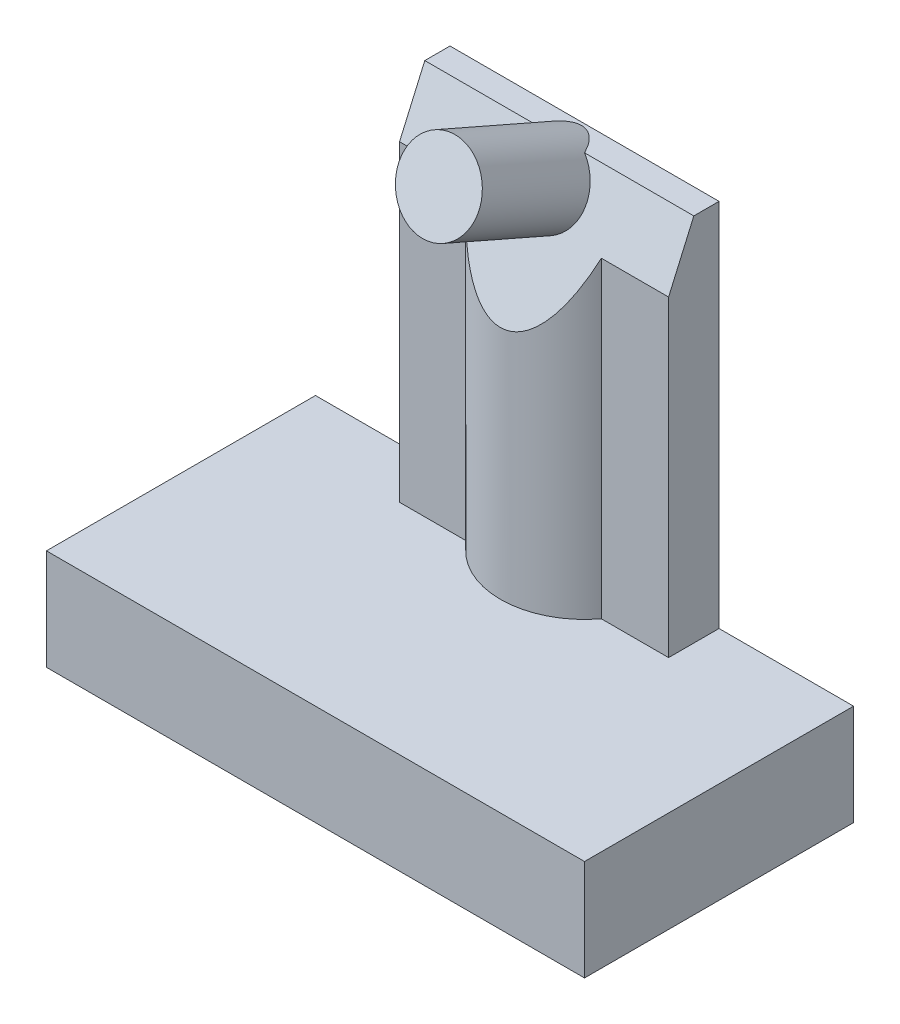
ISO-10303-21;
HEADER;
FILE_DESCRIPTION(('STEP AP214'),'2;1');
FILE_NAME('part.step','',(''),(''),'','','');
FILE_SCHEMA(('AUTOMOTIVE_DESIGN { 1 0 10303 214 1 1 1 1 }'));
ENDSEC;
DATA;
#1=APPLICATION_CONTEXT('core data for automotive mechanical design processes');
#2=APPLICATION_PROTOCOL_DEFINITION('international standard','automotive_design',2000,#1);
#3=PRODUCT_CONTEXT('',#1,'mechanical');
#4=PRODUCT('Part','Part','',(#3));
#5=PRODUCT_RELATED_PRODUCT_CATEGORY('part','',(#4));
#6=PRODUCT_DEFINITION_FORMATION('','',#4);
#7=PRODUCT_DEFINITION_CONTEXT('part definition',#1,'design');
#8=PRODUCT_DEFINITION('design','',#6,#7);
#9=PRODUCT_DEFINITION_SHAPE('','',#8);
#10=(LENGTH_UNIT() NAMED_UNIT(*) SI_UNIT(.MILLI.,.METRE.));
#11=(NAMED_UNIT(*) PLANE_ANGLE_UNIT() SI_UNIT($,.RADIAN.));
#12=(NAMED_UNIT(*) SI_UNIT($,.STERADIAN.) SOLID_ANGLE_UNIT());
#13=UNCERTAINTY_MEASURE_WITH_UNIT(LENGTH_MEASURE(1.E-05),#10,'distance_accuracy_value','');
#14=(GEOMETRIC_REPRESENTATION_CONTEXT(3) GLOBAL_UNCERTAINTY_ASSIGNED_CONTEXT((#13)) GLOBAL_UNIT_ASSIGNED_CONTEXT((#10,
#11,#12)) REPRESENTATION_CONTEXT('',''));
#15=CARTESIAN_POINT('',(0.,0.,0.));
#16=DIRECTION('',(0.,0.,1.));
#17=DIRECTION('',(1.,0.,0.));
#18=AXIS2_PLACEMENT_3D('',#15,#16,#17);
#19=CARTESIAN_POINT('',(-8.,10.,-1.5));
#20=DIRECTION('',(0.,-0.400818834019708,-0.916157334902189));
#21=DIRECTION('',(0.,0.916157334902189,-0.400818834019708));
#22=AXIS2_PLACEMENT_3D('',#19,#20,#21);
#23=PLANE('',#22);
#24=CARTESIAN_POINT('',(0.,13.1428571428571,-2.875));
#25=DIRECTION('',(0.,0.400818834019708,0.916157334902189));
#26=DIRECTION('',(0.,-0.916157334902189,0.400818834019708));
#27=AXIS2_PLACEMENT_3D('',#24,#25,#26);
#28=CIRCLE('',#27,1.2);
#29=CARTESIAN_POINT('',(-0.751452674789956,14.,-3.25));
#30=VERTEX_POINT('',#29);
#31=CARTESIAN_POINT('',(0.751452674789951,14.,-3.25000000000001));
#32=VERTEX_POINT('',#31);
#33=EDGE_CURVE('E51',#30,#32,#28,.T.);
#34=ORIENTED_EDGE('',*,*,#33,.F.);
#35=DIRECTION('',(-1.,0.,0.));
#36=VECTOR('',#35,1.);
#37=CARTESIAN_POINT('',(0.,14.,-3.25));
#38=LINE('',#37,#36);
#39=CARTESIAN_POINT('',(-4.00000000000001,14.,-3.25));
#40=VERTEX_POINT('',#39);
#41=EDGE_CURVE('E45',#30,#40,#38,.T.);
#42=ORIENTED_EDGE('',*,*,#41,.T.);
#43=DIRECTION('',(0.,0.916157334902189,-0.400818834019708));
#44=VECTOR('',#43,1.);
#45=CARTESIAN_POINT('',(-4.,12.8065573770492,-2.72786885245902));
#46=LINE('',#45,#44);
#47=CARTESIAN_POINT('',(-4.,12.2857142857143,-2.5));
#48=VERTEX_POINT('',#47);
#49=EDGE_CURVE('E169',#48,#40,#46,.T.);
#50=ORIENTED_EDGE('',*,*,#49,.F.);
#51=DIRECTION('',(-1.,0.,0.));
#52=VECTOR('',#51,1.);
#53=CARTESIAN_POINT('',(0.,12.2857142857143,-2.5));
#54=LINE('',#53,#52);
#55=CARTESIAN_POINT('',(-2.,12.2857142857143,-2.5));
#56=VERTEX_POINT('',#55);
#57=EDGE_CURVE('E166',#56,#48,#54,.T.);
#58=ORIENTED_EDGE('',*,*,#57,.F.);
#59=CARTESIAN_POINT('',(0.,15.7142857142857,-4.));
#60=DIRECTION('',(0.,-0.400818834019708,-0.916157334902189));
#61=DIRECTION('',(0.,-0.916157334902189,0.400818834019708));
#62=AXIS2_PLACEMENT_3D('',#59,#60,#61);
#63=ELLIPSE('',#62,6.23723185591892,2.5);
#64=CARTESIAN_POINT('',(2.,12.2857142857143,-2.5));
#65=VERTEX_POINT('',#64);
#66=EDGE_CURVE('E164',#65,#56,#63,.T.);
#67=ORIENTED_EDGE('',*,*,#66,.F.);
#68=DIRECTION('',(1.,0.,0.));
#69=VECTOR('',#68,1.);
#70=CARTESIAN_POINT('',(0.,12.2857142857143,-2.5));
#71=LINE('',#70,#69);
#72=CARTESIAN_POINT('',(4.,12.2857142857143,-2.5));
#73=VERTEX_POINT('',#72);
#74=EDGE_CURVE('E162',#65,#73,#71,.T.);
#75=ORIENTED_EDGE('',*,*,#74,.T.);
#76=DIRECTION('',(0.,0.916157334902189,-0.400818834019708));
#77=VECTOR('',#76,1.);
#78=CARTESIAN_POINT('',(4.,10.,-1.5));
#79=LINE('',#78,#77);
#80=CARTESIAN_POINT('',(4.,14.,-3.25));
#81=VERTEX_POINT('',#80);
#82=EDGE_CURVE('E57',#73,#81,#79,.T.);
#83=ORIENTED_EDGE('',*,*,#82,.T.);
#84=EDGE_CURVE('E11',#81,#32,#38,.T.);
#85=ORIENTED_EDGE('',*,*,#84,.T.);
#86=EDGE_LOOP('',(#34,#42,#50,#58,#67,#75,#83,#85));
#87=FACE_BOUND('',#86,.T.);
#88=ADVANCED_FACE('F37',(#87),#23,.F.);
#89=CARTESIAN_POINT('',(0.,3.,0.));
#90=DIRECTION('',(0.,1.,0.));
#91=DIRECTION('',(0.,0.,1.));
#92=AXIS2_PLACEMENT_3D('',#89,#90,#91);
#93=PLANE('',#92);
#94=DIRECTION('',(-1.,0.,0.));
#95=VECTOR('',#94,1.);
#96=CARTESIAN_POINT('',(-8.,3.,-4.));
#97=LINE('',#96,#95);
#98=CARTESIAN_POINT('',(8.,3.,-4.));
#99=VERTEX_POINT('',#98);
#100=CARTESIAN_POINT('',(4.,3.,-4.));
#101=VERTEX_POINT('',#100);
#102=EDGE_CURVE('E254',#99,#101,#97,.T.);
#103=ORIENTED_EDGE('',*,*,#102,.T.);
#104=DIRECTION('',(0.,0.,1.));
#105=VECTOR('',#104,1.);
#106=CARTESIAN_POINT('',(4.,3.,0.));
#107=LINE('',#106,#105);
#108=CARTESIAN_POINT('',(4.,3.,-2.5));
#109=VERTEX_POINT('',#108);
#110=EDGE_CURVE('E177',#101,#109,#107,.T.);
#111=ORIENTED_EDGE('',*,*,#110,.T.);
#112=DIRECTION('',(-1.,0.,0.));
#113=VECTOR('',#112,1.);
#114=CARTESIAN_POINT('',(0.,3.,-2.5));
#115=LINE('',#114,#113);
#116=CARTESIAN_POINT('',(2.,3.,-2.5));
#117=VERTEX_POINT('',#116);
#118=EDGE_CURVE('E190',#109,#117,#115,.T.);
#119=ORIENTED_EDGE('',*,*,#118,.T.);
#120=CARTESIAN_POINT('',(0.,3.,-4.));
#121=DIRECTION('',(0.,1.,0.));
#122=DIRECTION('',(0.,0.,1.));
#123=AXIS2_PLACEMENT_3D('',#120,#121,#122);
#124=CIRCLE('',#123,2.5);
#125=CARTESIAN_POINT('',(-2.,3.,-2.5));
#126=VERTEX_POINT('',#125);
#127=EDGE_CURVE('E187',#126,#117,#124,.T.);
#128=ORIENTED_EDGE('',*,*,#127,.F.);
#129=DIRECTION('',(1.,0.,0.));
#130=VECTOR('',#129,1.);
#131=CARTESIAN_POINT('',(0.,3.,-2.5));
#132=LINE('',#131,#130);
#133=CARTESIAN_POINT('',(-4.,3.,-2.5));
#134=VERTEX_POINT('',#133);
#135=EDGE_CURVE('E184',#134,#126,#132,.T.);
#136=ORIENTED_EDGE('',*,*,#135,.F.);
#137=DIRECTION('',(0.,0.,1.));
#138=VECTOR('',#137,1.);
#139=CARTESIAN_POINT('',(-4.,3.,0.));
#140=LINE('',#139,#138);
#141=CARTESIAN_POINT('',(-4.00000000000001,3.,-4.));
#142=VERTEX_POINT('',#141);
#143=EDGE_CURVE('E172',#142,#134,#140,.T.);
#144=ORIENTED_EDGE('',*,*,#143,.F.);
#145=CARTESIAN_POINT('',(-8.,3.,-4.));
#146=VERTEX_POINT('',#145);
#147=EDGE_CURVE('E252',#142,#146,#97,.T.);
#148=ORIENTED_EDGE('',*,*,#147,.T.);
#149=DIRECTION('',(0.,0.,1.));
#150=VECTOR('',#149,1.);
#151=CARTESIAN_POINT('',(-8.,3.,-4.));
#152=LINE('',#151,#150);
#153=CARTESIAN_POINT('',(-8.,3.,4.));
#154=VERTEX_POINT('',#153);
#155=EDGE_CURVE('E256',#146,#154,#152,.T.);
#156=ORIENTED_EDGE('',*,*,#155,.T.);
#157=DIRECTION('',(1.,0.,0.));
#158=VECTOR('',#157,1.);
#159=CARTESIAN_POINT('',(-8.,3.,4.));
#160=LINE('',#159,#158);
#161=CARTESIAN_POINT('',(7.99999999999999,3.,4.));
#162=VERTEX_POINT('',#161);
#163=EDGE_CURVE('E258',#154,#162,#160,.T.);
#164=ORIENTED_EDGE('',*,*,#163,.T.);
#165=DIRECTION('',(0.,0.,-1.));
#166=VECTOR('',#165,1.);
#167=CARTESIAN_POINT('',(8.,3.,-4.));
#168=LINE('',#167,#166);
#169=EDGE_CURVE('E249',#162,#99,#168,.T.);
#170=ORIENTED_EDGE('',*,*,#169,.T.);
#171=EDGE_LOOP('',(#103,#111,#119,#128,#136,#144,#148,#156,#164,#170));
#172=FACE_BOUND('',#171,.T.);
#173=ADVANCED_FACE('F294',(#172),#93,.T.);
#174=CARTESIAN_POINT('',(8.,3.,-4.));
#175=DIRECTION('',(-1.,0.,0.));
#176=DIRECTION('',(0.,0.,1.));
#177=AXIS2_PLACEMENT_3D('',#174,#175,#176);
#178=PLANE('',#177);
#179=DIRECTION('',(0.,0.,-1.));
#180=VECTOR('',#179,1.);
#181=CARTESIAN_POINT('',(8.,0.,-4.));
#182=LINE('',#181,#180);
#183=CARTESIAN_POINT('',(7.99999999999999,0.,4.));
#184=VERTEX_POINT('',#183);
#185=CARTESIAN_POINT('',(8.,0.,-4.));
#186=VERTEX_POINT('',#185);
#187=EDGE_CURVE('E221',#184,#186,#182,.T.);
#188=ORIENTED_EDGE('',*,*,#187,.T.);
#189=DIRECTION('',(0.,-1.,0.));
#190=VECTOR('',#189,1.);
#191=CARTESIAN_POINT('',(8.,3.,-4.));
#192=LINE('',#191,#190);
#193=EDGE_CURVE('E276',#99,#186,#192,.T.);
#194=ORIENTED_EDGE('',*,*,#193,.F.);
#195=ORIENTED_EDGE('',*,*,#169,.F.);
#196=DIRECTION('',(0.,-1.,0.));
#197=VECTOR('',#196,1.);
#198=CARTESIAN_POINT('',(7.99999999999999,3.,4.));
#199=LINE('',#198,#197);
#200=EDGE_CURVE('E260',#162,#184,#199,.T.);
#201=ORIENTED_EDGE('',*,*,#200,.T.);
#202=EDGE_LOOP('',(#188,#194,#195,#201));
#203=FACE_BOUND('',#202,.T.);
#204=ADVANCED_FACE('F39',(#203),#178,.F.);
#205=CARTESIAN_POINT('',(-8.,3.,-4.));
#206=DIRECTION('',(0.,0.,1.));
#207=DIRECTION('',(1.,0.,0.));
#208=AXIS2_PLACEMENT_3D('',#205,#206,#207);
#209=PLANE('',#208);
#210=DIRECTION('',(-1.,0.,0.));
#211=VECTOR('',#210,1.);
#212=CARTESIAN_POINT('',(-8.,0.,-4.));
#213=LINE('',#212,#211);
#214=CARTESIAN_POINT('',(-8.,0.,-4.));
#215=VERTEX_POINT('',#214);
#216=EDGE_CURVE('E263',#186,#215,#213,.T.);
#217=ORIENTED_EDGE('',*,*,#216,.T.);
#218=DIRECTION('',(0.,-1.,0.));
#219=VECTOR('',#218,1.);
#220=CARTESIAN_POINT('',(-8.,3.,-4.));
#221=LINE('',#220,#219);
#222=EDGE_CURVE('E273',#146,#215,#221,.T.);
#223=ORIENTED_EDGE('',*,*,#222,.F.);
#224=ORIENTED_EDGE('',*,*,#147,.F.);
#225=DIRECTION('',(0.,-1.,0.));
#226=VECTOR('',#225,1.);
#227=CARTESIAN_POINT('',(-4.00000000000001,14.,-4.));
#228=LINE('',#227,#226);
#229=CARTESIAN_POINT('',(-4.00000000000001,14.,-4.));
#230=VERTEX_POINT('',#229);
#231=EDGE_CURVE('E205',#230,#142,#228,.T.);
#232=ORIENTED_EDGE('',*,*,#231,.F.);
#233=DIRECTION('',(-1.,0.,0.));
#234=VECTOR('',#233,1.);
#235=CARTESIAN_POINT('',(0.,14.,-4.));
#236=LINE('',#235,#234);
#237=CARTESIAN_POINT('',(4.,14.,-4.));
#238=VERTEX_POINT('',#237);
#239=EDGE_CURVE('E173',#238,#230,#236,.T.);
#240=ORIENTED_EDGE('',*,*,#239,.F.);
#241=DIRECTION('',(0.,-1.,0.));
#242=VECTOR('',#241,1.);
#243=CARTESIAN_POINT('',(4.,14.,-4.));
#244=LINE('',#243,#242);
#245=EDGE_CURVE('E181',#238,#101,#244,.T.);
#246=ORIENTED_EDGE('',*,*,#245,.T.);
#247=ORIENTED_EDGE('',*,*,#102,.F.);
#248=ORIENTED_EDGE('',*,*,#193,.T.);
#249=EDGE_LOOP('',(#217,#223,#224,#232,#240,#246,#247,#248));
#250=FACE_BOUND('',#249,.T.);
#251=ADVANCED_FACE('F290',(#250),#209,.F.);
#252=CARTESIAN_POINT('',(-8.,3.,-4.));
#253=DIRECTION('',(1.,0.,0.));
#254=DIRECTION('',(0.,0.,-1.));
#255=AXIS2_PLACEMENT_3D('',#252,#253,#254);
#256=PLANE('',#255);
#257=DIRECTION('',(0.,0.,1.));
#258=VECTOR('',#257,1.);
#259=CARTESIAN_POINT('',(-8.,0.,-4.));
#260=LINE('',#259,#258);
#261=CARTESIAN_POINT('',(-8.,0.,4.));
#262=VERTEX_POINT('',#261);
#263=EDGE_CURVE('E265',#215,#262,#260,.T.);
#264=ORIENTED_EDGE('',*,*,#263,.T.);
#265=DIRECTION('',(0.,-1.,0.));
#266=VECTOR('',#265,1.);
#267=CARTESIAN_POINT('',(-8.,3.,4.));
#268=LINE('',#267,#266);
#269=EDGE_CURVE('E270',#154,#262,#268,.T.);
#270=ORIENTED_EDGE('',*,*,#269,.F.);
#271=ORIENTED_EDGE('',*,*,#155,.F.);
#272=ORIENTED_EDGE('',*,*,#222,.T.);
#273=EDGE_LOOP('',(#264,#270,#271,#272));
#274=FACE_BOUND('',#273,.T.);
#275=ADVANCED_FACE('F344',(#274),#256,.F.);
#276=CARTESIAN_POINT('',(-8.,3.,4.));
#277=DIRECTION('',(0.,0.,-1.));
#278=DIRECTION('',(-1.,0.,0.));
#279=AXIS2_PLACEMENT_3D('',#276,#277,#278);
#280=PLANE('',#279);
#281=DIRECTION('',(1.,0.,0.));
#282=VECTOR('',#281,1.);
#283=CARTESIAN_POINT('',(-8.,0.,4.));
#284=LINE('',#283,#282);
#285=EDGE_CURVE('E253',#262,#184,#284,.T.);
#286=ORIENTED_EDGE('',*,*,#285,.T.);
#287=ORIENTED_EDGE('',*,*,#200,.F.);
#288=ORIENTED_EDGE('',*,*,#163,.F.);
#289=ORIENTED_EDGE('',*,*,#269,.T.);
#290=EDGE_LOOP('',(#286,#287,#288,#289));
#291=FACE_BOUND('',#290,.T.);
#292=ADVANCED_FACE('F347',(#291),#280,.F.);
#293=CARTESIAN_POINT('',(0.,0.,0.));
#294=DIRECTION('',(0.,1.,0.));
#295=DIRECTION('',(0.,0.,1.));
#296=AXIS2_PLACEMENT_3D('',#293,#294,#295);
#297=PLANE('',#296);
#298=DIRECTION('',(1.,0.,0.));
#299=VECTOR('',#298,1.);
#300=CARTESIAN_POINT('',(-8.,0.,3.));
#301=LINE('',#300,#299);
#302=CARTESIAN_POINT('',(-7.,0.,3.));
#303=VERTEX_POINT('',#302);
#304=CARTESIAN_POINT('',(6.99999999999999,0.,3.));
#305=VERTEX_POINT('',#304);
#306=EDGE_CURVE('E227',#303,#305,#301,.T.);
#307=ORIENTED_EDGE('',*,*,#306,.T.);
#308=DIRECTION('',(0.,0.,-1.));
#309=VECTOR('',#308,1.);
#310=CARTESIAN_POINT('',(7.,0.,-4.));
#311=LINE('',#310,#309);
#312=CARTESIAN_POINT('',(7.,0.,-3.));
#313=VERTEX_POINT('',#312);
#314=EDGE_CURVE('E217',#305,#313,#311,.T.);
#315=ORIENTED_EDGE('',*,*,#314,.T.);
#316=DIRECTION('',(-1.,0.,0.));
#317=VECTOR('',#316,1.);
#318=CARTESIAN_POINT('',(-8.,0.,-3.));
#319=LINE('',#318,#317);
#320=CARTESIAN_POINT('',(-7.,0.,-3.));
#321=VERTEX_POINT('',#320);
#322=EDGE_CURVE('E241',#313,#321,#319,.T.);
#323=ORIENTED_EDGE('',*,*,#322,.T.);
#324=DIRECTION('',(0.,0.,1.));
#325=VECTOR('',#324,1.);
#326=CARTESIAN_POINT('',(-7.,0.,-4.));
#327=LINE('',#326,#325);
#328=EDGE_CURVE('E244',#321,#303,#327,.T.);
#329=ORIENTED_EDGE('',*,*,#328,.T.);
#330=EDGE_LOOP('',(#307,#315,#323,#329));
#331=FACE_BOUND('',#330,.T.);
#332=ORIENTED_EDGE('',*,*,#187,.F.);
#333=ORIENTED_EDGE('',*,*,#285,.F.);
#334=ORIENTED_EDGE('',*,*,#263,.F.);
#335=ORIENTED_EDGE('',*,*,#216,.F.);
#336=EDGE_LOOP('',(#332,#333,#334,#335));
#337=FACE_BOUND('',#336,.T.);
#338=ADVANCED_FACE('F340',(#331,#337),#297,.F.);
#339=CARTESIAN_POINT('',(7.,3.,-4.));
#340=DIRECTION('',(-1.,0.,0.));
#341=DIRECTION('',(0.,0.,1.));
#342=AXIS2_PLACEMENT_3D('',#339,#340,#341);
#343=PLANE('',#342);
#344=ORIENTED_EDGE('',*,*,#314,.F.);
#345=DIRECTION('',(0.,-1.,0.));
#346=VECTOR('',#345,1.);
#347=CARTESIAN_POINT('',(6.99999999999999,3.,3.));
#348=LINE('',#347,#346);
#349=CARTESIAN_POINT('',(6.99999999999999,2.,3.));
#350=VERTEX_POINT('',#349);
#351=EDGE_CURVE('E228',#350,#305,#348,.T.);
#352=ORIENTED_EDGE('',*,*,#351,.F.);
#353=DIRECTION('',(0.,0.,-1.));
#354=VECTOR('',#353,1.);
#355=CARTESIAN_POINT('',(7.,2.,-4.));
#356=LINE('',#355,#354);
#357=CARTESIAN_POINT('',(7.,2.,-3.));
#358=VERTEX_POINT('',#357);
#359=EDGE_CURVE('E223',#350,#358,#356,.T.);
#360=ORIENTED_EDGE('',*,*,#359,.T.);
#361=DIRECTION('',(0.,-1.,0.));
#362=VECTOR('',#361,1.);
#363=CARTESIAN_POINT('',(7.,3.,-3.));
#364=LINE('',#363,#362);
#365=EDGE_CURVE('E218',#358,#313,#364,.T.);
#366=ORIENTED_EDGE('',*,*,#365,.T.);
#367=EDGE_LOOP('',(#344,#352,#360,#366));
#368=FACE_BOUND('',#367,.T.);
#369=ADVANCED_FACE('F354',(#368),#343,.T.);
#370=CARTESIAN_POINT('',(-8.,3.,-3.));
#371=DIRECTION('',(0.,0.,1.));
#372=DIRECTION('',(1.,0.,0.));
#373=AXIS2_PLACEMENT_3D('',#370,#371,#372);
#374=PLANE('',#373);
#375=ORIENTED_EDGE('',*,*,#322,.F.);
#376=ORIENTED_EDGE('',*,*,#365,.F.);
#377=DIRECTION('',(-1.,0.,0.));
#378=VECTOR('',#377,1.);
#379=CARTESIAN_POINT('',(-8.,2.,-3.));
#380=LINE('',#379,#378);
#381=CARTESIAN_POINT('',(-7.,2.,-3.));
#382=VERTEX_POINT('',#381);
#383=EDGE_CURVE('E226',#358,#382,#380,.T.);
#384=ORIENTED_EDGE('',*,*,#383,.T.);
#385=DIRECTION('',(0.,-1.,0.));
#386=VECTOR('',#385,1.);
#387=CARTESIAN_POINT('',(-7.,3.,-3.));
#388=LINE('',#387,#386);
#389=EDGE_CURVE('E222',#382,#321,#388,.T.);
#390=ORIENTED_EDGE('',*,*,#389,.T.);
#391=EDGE_LOOP('',(#375,#376,#384,#390));
#392=FACE_BOUND('',#391,.T.);
#393=ADVANCED_FACE('F508',(#392),#374,.T.);
#394=CARTESIAN_POINT('',(-7.,3.,-4.));
#395=DIRECTION('',(1.,0.,0.));
#396=DIRECTION('',(0.,0.,-1.));
#397=AXIS2_PLACEMENT_3D('',#394,#395,#396);
#398=PLANE('',#397);
#399=ORIENTED_EDGE('',*,*,#328,.F.);
#400=ORIENTED_EDGE('',*,*,#389,.F.);
#401=DIRECTION('',(0.,0.,1.));
#402=VECTOR('',#401,1.);
#403=CARTESIAN_POINT('',(-7.,2.,-4.));
#404=LINE('',#403,#402);
#405=CARTESIAN_POINT('',(-7.,2.,3.));
#406=VERTEX_POINT('',#405);
#407=EDGE_CURVE('E235',#382,#406,#404,.T.);
#408=ORIENTED_EDGE('',*,*,#407,.T.);
#409=DIRECTION('',(0.,-1.,0.));
#410=VECTOR('',#409,1.);
#411=CARTESIAN_POINT('',(-7.,3.,3.));
#412=LINE('',#411,#410);
#413=EDGE_CURVE('E230',#406,#303,#412,.T.);
#414=ORIENTED_EDGE('',*,*,#413,.T.);
#415=EDGE_LOOP('',(#399,#400,#408,#414));
#416=FACE_BOUND('',#415,.T.);
#417=ADVANCED_FACE('F500',(#416),#398,.T.);
#418=CARTESIAN_POINT('',(-8.,3.,3.));
#419=DIRECTION('',(0.,0.,-1.));
#420=DIRECTION('',(-1.,0.,0.));
#421=AXIS2_PLACEMENT_3D('',#418,#419,#420);
#422=PLANE('',#421);
#423=ORIENTED_EDGE('',*,*,#306,.F.);
#424=ORIENTED_EDGE('',*,*,#413,.F.);
#425=DIRECTION('',(1.,0.,0.));
#426=VECTOR('',#425,1.);
#427=CARTESIAN_POINT('',(-8.,2.,3.));
#428=LINE('',#427,#426);
#429=EDGE_CURVE('E231',#406,#350,#428,.T.);
#430=ORIENTED_EDGE('',*,*,#429,.T.);
#431=ORIENTED_EDGE('',*,*,#351,.T.);
#432=EDGE_LOOP('',(#423,#424,#430,#431));
#433=FACE_BOUND('',#432,.T.);
#434=ADVANCED_FACE('F493',(#433),#422,.T.);
#435=CARTESIAN_POINT('',(0.,2.,0.));
#436=DIRECTION('',(0.,1.,0.));
#437=DIRECTION('',(0.,0.,1.));
#438=AXIS2_PLACEMENT_3D('',#435,#436,#437);
#439=PLANE('',#438);
#440=CARTESIAN_POINT('',(0.,2.,0.));
#441=DIRECTION('',(0.,1.,0.));
#442=DIRECTION('',(0.,0.,1.));
#443=AXIS2_PLACEMENT_3D('',#440,#441,#442);
#444=CIRCLE('',#443,1.5);
#445=CARTESIAN_POINT('',(0.,2.,1.5));
#446=VERTEX_POINT('',#445);
#447=EDGE_CURVE('E278',#446,#446,#444,.F.);
#448=ORIENTED_EDGE('',*,*,#447,.F.);
#449=EDGE_LOOP('',(#448));
#450=FACE_BOUND('',#449,.T.);
#451=ORIENTED_EDGE('',*,*,#359,.F.);
#452=ORIENTED_EDGE('',*,*,#429,.F.);
#453=ORIENTED_EDGE('',*,*,#407,.F.);
#454=ORIENTED_EDGE('',*,*,#383,.F.);
#455=EDGE_LOOP('',(#451,#452,#453,#454));
#456=FACE_BOUND('',#455,.T.);
#457=ADVANCED_FACE('F467',(#450,#456),#439,.F.);
#458=CARTESIAN_POINT('',(0.,0.,0.));
#459=DIRECTION('',(0.,-1.,0.));
#460=DIRECTION('',(0.,0.,-1.));
#461=AXIS2_PLACEMENT_3D('',#458,#459,#460);
#462=PLANE('',#461);
#463=CARTESIAN_POINT('',(0.,0.,0.));
#464=DIRECTION('',(0.,-1.,0.));
#465=DIRECTION('',(0.,0.,-1.));
#466=AXIS2_PLACEMENT_3D('',#463,#464,#465);
#467=CIRCLE('',#466,1.5);
#468=CARTESIAN_POINT('',(0.,0.,-1.5));
#469=VERTEX_POINT('',#468);
#470=EDGE_CURVE('E212',#469,#469,#467,.T.);
#471=ORIENTED_EDGE('',*,*,#470,.T.);
#472=EDGE_LOOP('',(#471));
#473=FACE_BOUND('',#472,.T.);
#474=CARTESIAN_POINT('',(0.,0.,0.));
#475=DIRECTION('',(0.,-1.,0.));
#476=DIRECTION('',(0.,0.,-1.));
#477=AXIS2_PLACEMENT_3D('',#474,#475,#476);
#478=CIRCLE('',#477,0.8);
#479=CARTESIAN_POINT('',(0.,0.,-0.8));
#480=VERTEX_POINT('',#479);
#481=EDGE_CURVE('E209',#480,#480,#478,.T.);
#482=ORIENTED_EDGE('',*,*,#481,.F.);
#483=EDGE_LOOP('',(#482));
#484=FACE_BOUND('',#483,.T.);
#485=ADVANCED_FACE('F478',(#473,#484),#462,.T.);
#486=CARTESIAN_POINT('',(0.,0.,0.));
#487=DIRECTION('',(0.,1.,0.));
#488=DIRECTION('',(0.,0.,1.));
#489=AXIS2_PLACEMENT_3D('',#486,#487,#488);
#490=CYLINDRICAL_SURFACE('',#489,1.5);
#491=ORIENTED_EDGE('',*,*,#470,.F.);
#492=EDGE_LOOP('',(#491));
#493=FACE_BOUND('',#492,.T.);
#494=ORIENTED_EDGE('',*,*,#447,.T.);
#495=EDGE_LOOP('',(#494));
#496=FACE_BOUND('',#495,.T.);
#497=ADVANCED_FACE('F470',(#493,#496),#490,.T.);
#498=CARTESIAN_POINT('',(0.,0.,0.));
#499=DIRECTION('',(0.,1.,0.));
#500=DIRECTION('',(0.,0.,1.));
#501=AXIS2_PLACEMENT_3D('',#498,#499,#500);
#502=CYLINDRICAL_SURFACE('',#501,0.8);
#503=ORIENTED_EDGE('',*,*,#481,.T.);
#504=EDGE_LOOP('',(#503));
#505=FACE_BOUND('',#504,.T.);
#506=CARTESIAN_POINT('',(0.,2.,0.));
#507=DIRECTION('',(0.,-1.,0.));
#508=DIRECTION('',(0.,0.,-1.));
#509=AXIS2_PLACEMENT_3D('',#506,#507,#508);
#510=CIRCLE('',#509,0.8);
#511=CARTESIAN_POINT('',(0.,2.,-0.8));
#512=VERTEX_POINT('',#511);
#513=EDGE_CURVE('E208',#512,#512,#510,.T.);
#514=ORIENTED_EDGE('',*,*,#513,.F.);
#515=EDGE_LOOP('',(#514));
#516=FACE_BOUND('',#515,.T.);
#517=ADVANCED_FACE('F464',(#505,#516),#502,.F.);
#518=ORIENTED_EDGE('',*,*,#513,.T.);
#519=EDGE_LOOP('',(#518));
#520=FACE_BOUND('',#519,.T.);
#521=ADVANCED_FACE('F376',(#520),#439,.F.);
#522=CARTESIAN_POINT('',(-4.,14.,0.));
#523=DIRECTION('',(1.,0.,0.));
#524=DIRECTION('',(0.,0.,-1.));
#525=AXIS2_PLACEMENT_3D('',#522,#523,#524);
#526=PLANE('',#525);
#527=DIRECTION('',(0.,-1.,0.));
#528=VECTOR('',#527,1.);
#529=CARTESIAN_POINT('',(-4.,14.,-2.5));
#530=LINE('',#529,#528);
#531=EDGE_CURVE('E203',#48,#134,#530,.T.);
#532=ORIENTED_EDGE('',*,*,#531,.F.);
#533=ORIENTED_EDGE('',*,*,#49,.T.);
#534=DIRECTION('',(0.,0.,1.));
#535=VECTOR('',#534,1.);
#536=CARTESIAN_POINT('',(-4.,14.,0.));
#537=LINE('',#536,#535);
#538=EDGE_CURVE('E176',#230,#40,#537,.T.);
#539=ORIENTED_EDGE('',*,*,#538,.F.);
#540=ORIENTED_EDGE('',*,*,#231,.T.);
#541=ORIENTED_EDGE('',*,*,#143,.T.);
#542=EDGE_LOOP('',(#532,#533,#539,#540,#541));
#543=FACE_BOUND('',#542,.T.);
#544=ADVANCED_FACE('F285',(#543),#526,.F.);
#545=CARTESIAN_POINT('',(0.,14.,-2.5));
#546=DIRECTION('',(0.,0.,-1.));
#547=DIRECTION('',(-1.,0.,0.));
#548=AXIS2_PLACEMENT_3D('',#545,#546,#547);
#549=PLANE('',#548);
#550=DIRECTION('',(0.,-1.,0.));
#551=VECTOR('',#550,1.);
#552=CARTESIAN_POINT('',(-2.,14.,-2.5));
#553=LINE('',#552,#551);
#554=EDGE_CURVE('E201',#56,#126,#553,.T.);
#555=ORIENTED_EDGE('',*,*,#554,.F.);
#556=ORIENTED_EDGE('',*,*,#57,.T.);
#557=ORIENTED_EDGE('',*,*,#531,.T.);
#558=ORIENTED_EDGE('',*,*,#135,.T.);
#559=EDGE_LOOP('',(#555,#556,#557,#558));
#560=FACE_BOUND('',#559,.T.);
#561=ADVANCED_FACE('F298',(#560),#549,.F.);
#562=CARTESIAN_POINT('',(0.,14.,-4.));
#563=DIRECTION('',(0.,-1.,0.));
#564=DIRECTION('',(0.,0.,-1.));
#565=AXIS2_PLACEMENT_3D('',#562,#563,#564);
#566=CYLINDRICAL_SURFACE('',#565,2.5);
#567=ORIENTED_EDGE('',*,*,#66,.T.);
#568=ORIENTED_EDGE('',*,*,#554,.T.);
#569=ORIENTED_EDGE('',*,*,#127,.T.);
#570=DIRECTION('',(0.,-1.,0.));
#571=VECTOR('',#570,1.);
#572=CARTESIAN_POINT('',(2.,14.,-2.5));
#573=LINE('',#572,#571);
#574=EDGE_CURVE('E199',#65,#117,#573,.T.);
#575=ORIENTED_EDGE('',*,*,#574,.F.);
#576=EDGE_LOOP('',(#567,#568,#569,#575));
#577=FACE_BOUND('',#576,.T.);
#578=ADVANCED_FACE('F306',(#577),#566,.T.);
#579=CARTESIAN_POINT('',(0.,14.,-2.5));
#580=DIRECTION('',(0.,0.,1.));
#581=DIRECTION('',(1.,0.,0.));
#582=AXIS2_PLACEMENT_3D('',#579,#580,#581);
#583=PLANE('',#582);
#584=ORIENTED_EDGE('',*,*,#74,.F.);
#585=ORIENTED_EDGE('',*,*,#574,.T.);
#586=ORIENTED_EDGE('',*,*,#118,.F.);
#587=DIRECTION('',(0.,-1.,0.));
#588=VECTOR('',#587,1.);
#589=CARTESIAN_POINT('',(4.,14.,-2.5));
#590=LINE('',#589,#588);
#591=EDGE_CURVE('E197',#73,#109,#590,.T.);
#592=ORIENTED_EDGE('',*,*,#591,.F.);
#593=EDGE_LOOP('',(#584,#585,#586,#592));
#594=FACE_BOUND('',#593,.T.);
#595=ADVANCED_FACE('F304',(#594),#583,.T.);
#596=CARTESIAN_POINT('',(4.,14.,0.));
#597=DIRECTION('',(1.,0.,0.));
#598=DIRECTION('',(0.,0.,-1.));
#599=AXIS2_PLACEMENT_3D('',#596,#597,#598);
#600=PLANE('',#599);
#601=ORIENTED_EDGE('',*,*,#82,.F.);
#602=ORIENTED_EDGE('',*,*,#591,.T.);
#603=ORIENTED_EDGE('',*,*,#110,.F.);
#604=ORIENTED_EDGE('',*,*,#245,.F.);
#605=DIRECTION('',(0.,0.,1.));
#606=VECTOR('',#605,1.);
#607=CARTESIAN_POINT('',(4.,14.,0.));
#608=LINE('',#607,#606);
#609=EDGE_CURVE('E179',#238,#81,#608,.T.);
#610=ORIENTED_EDGE('',*,*,#609,.T.);
#611=EDGE_LOOP('',(#601,#602,#603,#604,#610));
#612=FACE_BOUND('',#611,.T.);
#613=ADVANCED_FACE('F313',(#612),#600,.T.);
#614=CARTESIAN_POINT('',(0.,14.,0.));
#615=DIRECTION('',(0.,1.,0.));
#616=DIRECTION('',(0.,0.,1.));
#617=AXIS2_PLACEMENT_3D('',#614,#615,#616);
#618=PLANE('',#617);
#619=ORIENTED_EDGE('',*,*,#41,.F.);
#620=CARTESIAN_POINT('',(0.,14.,-0.915816326530618));
#621=DIRECTION('',(0.,1.,0.));
#622=DIRECTION('',(0.,0.,1.));
#623=AXIS2_PLACEMENT_3D('',#620,#621,#622);
#624=ELLIPSE('',#623,2.99387129084108,1.2);
#625=EDGE_CURVE('E150',#30,#32,#624,.F.);
#626=ORIENTED_EDGE('',*,*,#625,.T.);
#627=ORIENTED_EDGE('',*,*,#84,.F.);
#628=ORIENTED_EDGE('',*,*,#609,.F.);
#629=ORIENTED_EDGE('',*,*,#239,.T.);
#630=ORIENTED_EDGE('',*,*,#538,.T.);
#631=EDGE_LOOP('',(#619,#626,#627,#628,#629,#630));
#632=FACE_BOUND('',#631,.T.);
#633=ADVANCED_FACE('F151',(#632),#618,.T.);
#634=CARTESIAN_POINT('',(0.,14.5457230619261,0.331550672157658));
#635=DIRECTION('',(0.,-0.400818834019708,-0.916157334902189));
#636=DIRECTION('',(0.,0.916157334902189,-0.400818834019708));
#637=AXIS2_PLACEMENT_3D('',#634,#635,#636);
#638=CYLINDRICAL_SURFACE('',#637,1.2);
#639=CARTESIAN_POINT('',(0.,14.5457230619261,0.331550672157658));
#640=DIRECTION('',(0.,0.400818834019708,0.916157334902189));
#641=DIRECTION('',(0.,-0.916157334902189,0.400818834019708));
#642=AXIS2_PLACEMENT_3D('',#639,#640,#641);
#643=CIRCLE('',#642,1.2);
#644=CARTESIAN_POINT('',(0.,13.4463342600435,0.812533272981307));
#645=VERTEX_POINT('',#644);
#646=EDGE_CURVE('E156',#645,#645,#643,.T.);
#647=ORIENTED_EDGE('',*,*,#646,.F.);
#648=EDGE_LOOP('',(#647));
#649=FACE_BOUND('',#648,.T.);
#650=ORIENTED_EDGE('',*,*,#33,.T.);
#651=ORIENTED_EDGE('',*,*,#625,.F.);
#652=EDGE_LOOP('',(#650,#651));
#653=FACE_BOUND('',#652,.T.);
#654=ADVANCED_FACE('F155',(#649,#653),#638,.T.);
#655=CARTESIAN_POINT('',(0.,14.5457230619261,0.331550672157658));
#656=DIRECTION('',(0.,0.400818834019708,0.916157334902189));
#657=DIRECTION('',(0.,-0.916157334902189,0.400818834019708));
#658=AXIS2_PLACEMENT_3D('',#655,#656,#657);
#659=PLANE('',#658);
#660=ORIENTED_EDGE('',*,*,#646,.T.);
#661=EDGE_LOOP('',(#660));
#662=FACE_BOUND('',#661,.T.);
#663=ADVANCED_FACE('F436',(#662),#659,.T.);
#664=CLOSED_SHELL('',(#88,#173,#204,#251,#275,#292,#338,#369,#393,#417,#434,#457,#485,#497,#517,
#521,#544,#561,#578,#595,#613,#633,#654,#663));
#665=MANIFOLD_SOLID_BREP('B2',#664);
#666=ADVANCED_BREP_SHAPE_REPRESENTATION('',(#18,#665),#14);
#667=SHAPE_DEFINITION_REPRESENTATION(#9,#666);
ENDSEC;
END-ISO-10303-21;
